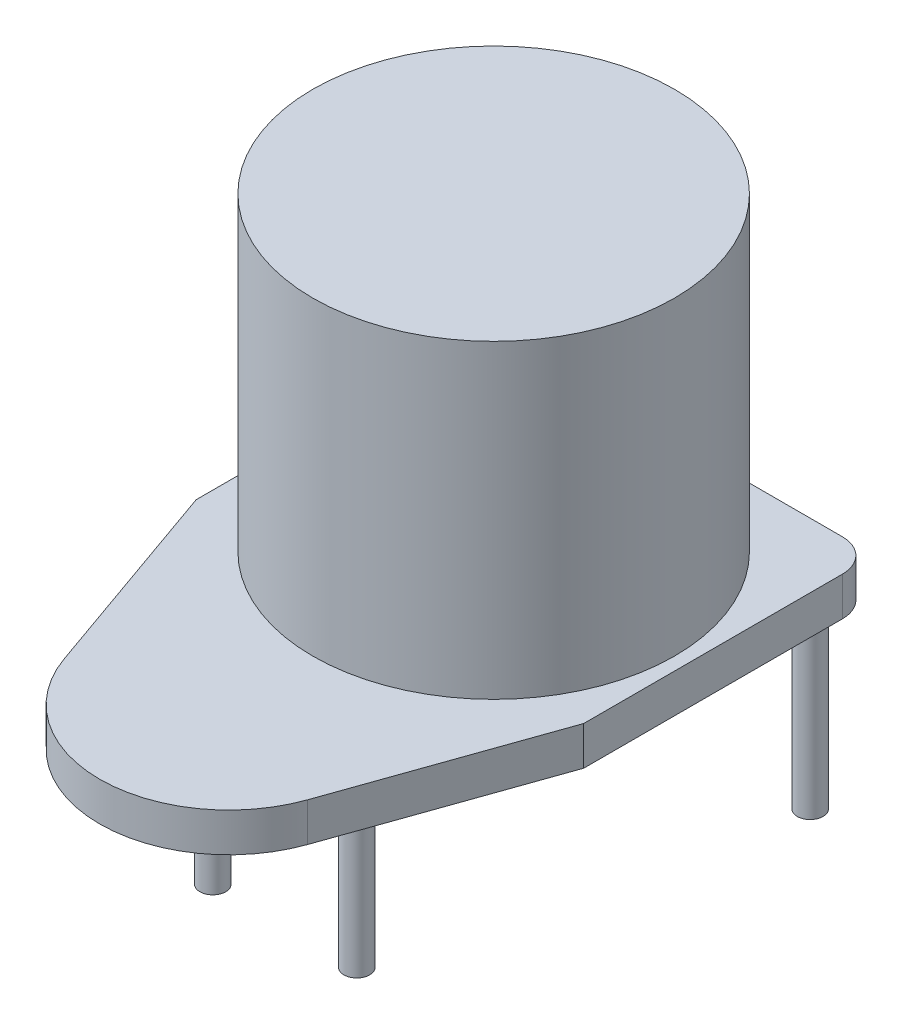
ISO-10303-21;
HEADER;
FILE_DESCRIPTION(('STEP AP214'),'2;1');
FILE_NAME('part.step','',(''),(''),'','','');
FILE_SCHEMA(('AUTOMOTIVE_DESIGN { 1 0 10303 214 1 1 1 1 }'));
ENDSEC;
DATA;
#1=APPLICATION_CONTEXT('core data for automotive mechanical design processes');
#2=APPLICATION_PROTOCOL_DEFINITION('international standard','automotive_design',2000,#1);
#3=PRODUCT_CONTEXT('',#1,'mechanical');
#4=PRODUCT('Part','Part','',(#3));
#5=PRODUCT_RELATED_PRODUCT_CATEGORY('part','',(#4));
#6=PRODUCT_DEFINITION_FORMATION('','',#4);
#7=PRODUCT_DEFINITION_CONTEXT('part definition',#1,'design');
#8=PRODUCT_DEFINITION('design','',#6,#7);
#9=PRODUCT_DEFINITION_SHAPE('','',#8);
#10=(LENGTH_UNIT() NAMED_UNIT(*) SI_UNIT(.MILLI.,.METRE.));
#11=(NAMED_UNIT(*) PLANE_ANGLE_UNIT() SI_UNIT($,.RADIAN.));
#12=(NAMED_UNIT(*) SI_UNIT($,.STERADIAN.) SOLID_ANGLE_UNIT());
#13=UNCERTAINTY_MEASURE_WITH_UNIT(LENGTH_MEASURE(1.E-05),#10,'distance_accuracy_value','');
#14=(GEOMETRIC_REPRESENTATION_CONTEXT(3) GLOBAL_UNCERTAINTY_ASSIGNED_CONTEXT((#13)) GLOBAL_UNIT_ASSIGNED_CONTEXT((#10,
#11,#12)) REPRESENTATION_CONTEXT('',''));
#15=CARTESIAN_POINT('',(0.,0.,0.));
#16=DIRECTION('',(0.,0.,1.));
#17=DIRECTION('',(1.,0.,0.));
#18=AXIS2_PLACEMENT_3D('',#15,#16,#17);
#19=CARTESIAN_POINT('',(-38.1,45.72,0.));
#20=DIRECTION('',(-1.,0.,0.));
#21=DIRECTION('',(0.,0.,1.));
#22=AXIS2_PLACEMENT_3D('',#19,#20,#21);
#23=PLANE('',#22);
#24=DIRECTION('',(0.,0.,-1.));
#25=VECTOR('',#24,1.);
#26=CARTESIAN_POINT('',(-38.1,45.72,0.));
#27=LINE('',#26,#25);
#28=CARTESIAN_POINT('',(-38.1,45.72,0.419392834796002));
#29=VERTEX_POINT('',#28);
#30=CARTESIAN_POINT('',(-38.1,45.72,-50.4498441610668));
#31=VERTEX_POINT('',#30);
#32=EDGE_CURVE('E161',#29,#31,#27,.T.);
#33=ORIENTED_EDGE('',*,*,#32,.T.);
#34=DIRECTION('',(0.,-1.,0.));
#35=VECTOR('',#34,1.);
#36=CARTESIAN_POINT('',(-38.1,38.1,-50.4498441610668));
#37=LINE('',#36,#35);
#38=CARTESIAN_POINT('',(-38.1,38.1,-50.4498441610668));
#39=VERTEX_POINT('',#38);
#40=EDGE_CURVE('E80',#31,#39,#37,.T.);
#41=ORIENTED_EDGE('',*,*,#40,.T.);
#42=DIRECTION('',(0.,0.,-1.));
#43=VECTOR('',#42,1.);
#44=CARTESIAN_POINT('',(-38.1,38.1,0.));
#45=LINE('',#44,#43);
#46=CARTESIAN_POINT('',(-38.1,38.1,0.419392834796002));
#47=VERTEX_POINT('',#46);
#48=EDGE_CURVE('E163',#47,#39,#45,.T.);
#49=ORIENTED_EDGE('',*,*,#48,.F.);
#50=DIRECTION('',(0.,-1.,0.));
#51=VECTOR('',#50,1.);
#52=CARTESIAN_POINT('',(-38.1,45.72,0.419392834796002));
#53=LINE('',#52,#51);
#54=EDGE_CURVE('E202',#29,#47,#53,.T.);
#55=ORIENTED_EDGE('',*,*,#54,.F.);
#56=EDGE_LOOP('',(#33,#41,#49,#55));
#57=FACE_BOUND('',#56,.T.);
#58=ADVANCED_FACE('F76',(#57),#23,.T.);
#59=CARTESIAN_POINT('',(0.,38.1,0.));
#60=DIRECTION('',(0.,1.,0.));
#61=DIRECTION('',(0.,0.,1.));
#62=AXIS2_PLACEMENT_3D('',#59,#60,#61);
#63=PLANE('',#62);
#64=CARTESIAN_POINT('',(14.1546468084681,38.1,21.0904237446174));
#65=DIRECTION('',(0.,1.,0.));
#66=DIRECTION('',(0.,0.,1.));
#67=AXIS2_PLACEMENT_3D('',#64,#65,#66);
#68=CIRCLE('',#67,2.54);
#69=CARTESIAN_POINT('',(14.1546468084681,38.1,23.6304237446175));
#70=VERTEX_POINT('',#69);
#71=EDGE_CURVE('E239',#70,#70,#68,.T.);
#72=ORIENTED_EDGE('',*,*,#71,.T.);
#73=EDGE_LOOP('',(#72));
#74=FACE_BOUND('',#73,.T.);
#75=CARTESIAN_POINT('',(-14.1546468084681,38.1,21.0904237446175));
#76=DIRECTION('',(0.,1.,0.));
#77=DIRECTION('',(0.,0.,1.));
#78=AXIS2_PLACEMENT_3D('',#75,#76,#77);
#79=CIRCLE('',#78,2.54);
#80=CARTESIAN_POINT('',(-14.1546468084681,38.1,23.6304237446175));
#81=VERTEX_POINT('',#80);
#82=EDGE_CURVE('E233',#81,#81,#79,.T.);
#83=ORIENTED_EDGE('',*,*,#82,.T.);
#84=EDGE_LOOP('',(#83));
#85=FACE_BOUND('',#84,.T.);
#86=CARTESIAN_POINT('',(31.75,38.1,-50.4498441610668));
#87=DIRECTION('',(0.,1.,0.));
#88=DIRECTION('',(0.,0.,1.));
#89=AXIS2_PLACEMENT_3D('',#86,#87,#88);
#90=CIRCLE('',#89,2.54);
#91=CARTESIAN_POINT('',(31.75,38.1,-47.9098441610668));
#92=VERTEX_POINT('',#91);
#93=EDGE_CURVE('E227',#92,#92,#90,.T.);
#94=ORIENTED_EDGE('',*,*,#93,.T.);
#95=EDGE_LOOP('',(#94));
#96=FACE_BOUND('',#95,.T.);
#97=CARTESIAN_POINT('',(-31.75,38.1,-50.4498441610668));
#98=DIRECTION('',(0.,1.,0.));
#99=DIRECTION('',(0.,0.,1.));
#100=AXIS2_PLACEMENT_3D('',#97,#98,#99);
#101=CIRCLE('',#100,2.54);
#102=CARTESIAN_POINT('',(-31.75,38.1,-47.9098441610668));
#103=VERTEX_POINT('',#102);
#104=EDGE_CURVE('E216',#103,#103,#101,.T.);
#105=ORIENTED_EDGE('',*,*,#104,.T.);
#106=EDGE_LOOP('',(#105));
#107=FACE_BOUND('',#106,.T.);
#108=DIRECTION('',(-1.,0.,0.));
#109=VECTOR('',#108,1.);
#110=CARTESIAN_POINT('',(0.,38.1,-56.7998441610668));
#111=LINE('',#110,#109);
#112=CARTESIAN_POINT('',(31.75,38.1,-56.7998441610668));
#113=VERTEX_POINT('',#112);
#114=CARTESIAN_POINT('',(-31.75,38.1,-56.7998441610668));
#115=VERTEX_POINT('',#114);
#116=EDGE_CURVE('E196',#113,#115,#111,.T.);
#117=ORIENTED_EDGE('',*,*,#116,.F.);
#118=CARTESIAN_POINT('',(31.75,38.1,-50.4498441610668));
#119=DIRECTION('',(0.,1.,0.));
#120=DIRECTION('',(0.,0.,1.));
#121=AXIS2_PLACEMENT_3D('',#118,#119,#120);
#122=CIRCLE('',#121,6.35);
#123=CARTESIAN_POINT('',(38.1,38.1,-50.4498441610668));
#124=VERTEX_POINT('',#123);
#125=EDGE_CURVE('E180',#113,#124,#122,.F.);
#126=ORIENTED_EDGE('',*,*,#125,.T.);
#127=DIRECTION('',(0.,0.,-1.));
#128=VECTOR('',#127,1.);
#129=CARTESIAN_POINT('',(38.1,38.1,0.));
#130=LINE('',#129,#128);
#131=CARTESIAN_POINT('',(38.1,38.1,0.419392834796007));
#132=VERTEX_POINT('',#131);
#133=EDGE_CURVE('E198',#132,#124,#130,.T.);
#134=ORIENTED_EDGE('',*,*,#133,.F.);
#135=DIRECTION('',(-0.33246409694842,0.,0.943115912409642));
#136=VECTOR('',#135,1.);
#137=CARTESIAN_POINT('',(34.0202180212385,38.1,11.9926945496247));
#138=LINE('',#137,#136);
#139=CARTESIAN_POINT('',(23.9551441752049,38.1,40.544743901423));
#140=VERTEX_POINT('',#139);
#141=EDGE_CURVE('E209',#132,#140,#138,.T.);
#142=ORIENTED_EDGE('',*,*,#141,.T.);
#143=CARTESIAN_POINT('',(0.,38.1,32.1001558389332));
#144=DIRECTION('',(0.,1.,0.));
#145=DIRECTION('',(0.,0.,1.));
#146=AXIS2_PLACEMENT_3D('',#143,#144,#145);
#147=CIRCLE('',#146,25.4);
#148=CARTESIAN_POINT('',(-23.9551441752049,38.1,40.544743901423));
#149=VERTEX_POINT('',#148);
#150=EDGE_CURVE('E211',#149,#140,#147,.T.);
#151=ORIENTED_EDGE('',*,*,#150,.F.);
#152=DIRECTION('',(0.33246409694842,0.,0.943115912409642));
#153=VECTOR('',#152,1.);
#154=CARTESIAN_POINT('',(-34.0202180212385,38.1,11.9926945496246));
#155=LINE('',#154,#153);
#156=EDGE_CURVE('E167',#47,#149,#155,.T.);
#157=ORIENTED_EDGE('',*,*,#156,.F.);
#158=ORIENTED_EDGE('',*,*,#48,.T.);
#159=CARTESIAN_POINT('',(-31.75,38.1,-50.4498441610668));
#160=DIRECTION('',(0.,1.,0.));
#161=DIRECTION('',(0.,0.,1.));
#162=AXIS2_PLACEMENT_3D('',#159,#160,#161);
#163=CIRCLE('',#162,6.35);
#164=EDGE_CURVE('E178',#39,#115,#163,.F.);
#165=ORIENTED_EDGE('',*,*,#164,.T.);
#166=EDGE_LOOP('',(#117,#126,#134,#142,#151,#157,#158,#165));
#167=FACE_BOUND('',#166,.T.);
#168=ADVANCED_FACE('F194',(#74,#85,#96,#107,#167),#63,.F.);
#169=CARTESIAN_POINT('',(0.,45.72,-56.7998441610668));
#170=DIRECTION('',(0.,0.,1.));
#171=DIRECTION('',(1.,0.,0.));
#172=AXIS2_PLACEMENT_3D('',#169,#170,#171);
#173=PLANE('',#172);
#174=DIRECTION('',(-1.,0.,0.));
#175=VECTOR('',#174,1.);
#176=CARTESIAN_POINT('',(0.,45.72,-56.7998441610668));
#177=LINE('',#176,#175);
#178=CARTESIAN_POINT('',(31.75,45.72,-56.7998441610668));
#179=VERTEX_POINT('',#178);
#180=CARTESIAN_POINT('',(-31.75,45.72,-56.7998441610668));
#181=VERTEX_POINT('',#180);
#182=EDGE_CURVE('E218',#179,#181,#177,.T.);
#183=ORIENTED_EDGE('',*,*,#182,.F.);
#184=DIRECTION('',(0.,-1.,0.));
#185=VECTOR('',#184,1.);
#186=CARTESIAN_POINT('',(31.75,45.72,-56.7998441610668));
#187=LINE('',#186,#185);
#188=EDGE_CURVE('E170',#179,#113,#187,.T.);
#189=ORIENTED_EDGE('',*,*,#188,.T.);
#190=ORIENTED_EDGE('',*,*,#116,.T.);
#191=DIRECTION('',(0.,-1.,0.));
#192=VECTOR('',#191,1.);
#193=CARTESIAN_POINT('',(-31.75,45.72,-56.7998441610668));
#194=LINE('',#193,#192);
#195=EDGE_CURVE('E168',#115,#181,#194,.F.);
#196=ORIENTED_EDGE('',*,*,#195,.T.);
#197=EDGE_LOOP('',(#183,#189,#190,#196));
#198=FACE_BOUND('',#197,.T.);
#199=ADVANCED_FACE('F270',(#198),#173,.F.);
#200=CARTESIAN_POINT('',(38.1,45.72,0.));
#201=DIRECTION('',(-1.,0.,0.));
#202=DIRECTION('',(0.,0.,1.));
#203=AXIS2_PLACEMENT_3D('',#200,#201,#202);
#204=PLANE('',#203);
#205=ORIENTED_EDGE('',*,*,#133,.T.);
#206=DIRECTION('',(0.,-1.,0.));
#207=VECTOR('',#206,1.);
#208=CARTESIAN_POINT('',(38.1,45.72,-50.4498441610668));
#209=LINE('',#208,#207);
#210=CARTESIAN_POINT('',(38.1,45.72,-50.4498441610668));
#211=VERTEX_POINT('',#210);
#212=EDGE_CURVE('E100',#124,#211,#209,.F.);
#213=ORIENTED_EDGE('',*,*,#212,.T.);
#214=DIRECTION('',(0.,0.,-1.));
#215=VECTOR('',#214,1.);
#216=CARTESIAN_POINT('',(38.1,45.72,0.));
#217=LINE('',#216,#215);
#218=CARTESIAN_POINT('',(38.1,45.72,0.419392834796007));
#219=VERTEX_POINT('',#218);
#220=EDGE_CURVE('E205',#219,#211,#217,.T.);
#221=ORIENTED_EDGE('',*,*,#220,.F.);
#222=DIRECTION('',(0.,-1.,0.));
#223=VECTOR('',#222,1.);
#224=CARTESIAN_POINT('',(38.1,45.72,0.419392834796007));
#225=LINE('',#224,#223);
#226=EDGE_CURVE('E172',#219,#132,#225,.T.);
#227=ORIENTED_EDGE('',*,*,#226,.T.);
#228=EDGE_LOOP('',(#205,#213,#221,#227));
#229=FACE_BOUND('',#228,.T.);
#230=ADVANCED_FACE('F204',(#229),#204,.F.);
#231=CARTESIAN_POINT('',(34.0202180212385,45.72,11.9926945496247));
#232=DIRECTION('',(0.943115912409642,0.,0.33246409694842));
#233=DIRECTION('',(0.33246409694842,0.,-0.943115912409642));
#234=AXIS2_PLACEMENT_3D('',#231,#232,#233);
#235=PLANE('',#234);
#236=ORIENTED_EDGE('',*,*,#141,.F.);
#237=ORIENTED_EDGE('',*,*,#226,.F.);
#238=DIRECTION('',(-0.33246409694842,0.,0.943115912409642));
#239=VECTOR('',#238,1.);
#240=CARTESIAN_POINT('',(34.0202180212385,45.72,11.9926945496247));
#241=LINE('',#240,#239);
#242=CARTESIAN_POINT('',(23.9551441752049,45.72,40.544743901423));
#243=VERTEX_POINT('',#242);
#244=EDGE_CURVE('E156',#219,#243,#241,.T.);
#245=ORIENTED_EDGE('',*,*,#244,.T.);
#246=DIRECTION('',(0.,-1.,0.));
#247=VECTOR('',#246,1.);
#248=CARTESIAN_POINT('',(23.9551441752049,45.72,40.544743901423));
#249=LINE('',#248,#247);
#250=EDGE_CURVE('E153',#243,#140,#249,.T.);
#251=ORIENTED_EDGE('',*,*,#250,.T.);
#252=EDGE_LOOP('',(#236,#237,#245,#251));
#253=FACE_BOUND('',#252,.T.);
#254=ADVANCED_FACE('F210',(#253),#235,.T.);
#255=CARTESIAN_POINT('',(0.,45.72,32.1001558389332));
#256=DIRECTION('',(0.,-1.,0.));
#257=DIRECTION('',(0.,0.,-1.));
#258=AXIS2_PLACEMENT_3D('',#255,#256,#257);
#259=CYLINDRICAL_SURFACE('',#258,25.4);
#260=ORIENTED_EDGE('',*,*,#150,.T.);
#261=ORIENTED_EDGE('',*,*,#250,.F.);
#262=CARTESIAN_POINT('',(0.,45.72,32.1001558389332));
#263=DIRECTION('',(0.,1.,0.));
#264=DIRECTION('',(0.,0.,1.));
#265=AXIS2_PLACEMENT_3D('',#262,#263,#264);
#266=CIRCLE('',#265,25.4);
#267=CARTESIAN_POINT('',(-23.9551441752049,45.72,40.544743901423));
#268=VERTEX_POINT('',#267);
#269=EDGE_CURVE('E146',#268,#243,#266,.T.);
#270=ORIENTED_EDGE('',*,*,#269,.F.);
#271=DIRECTION('',(0.,-1.,0.));
#272=VECTOR('',#271,1.);
#273=CARTESIAN_POINT('',(-23.9551441752049,45.72,40.544743901423));
#274=LINE('',#273,#272);
#275=EDGE_CURVE('E151',#268,#149,#274,.T.);
#276=ORIENTED_EDGE('',*,*,#275,.T.);
#277=EDGE_LOOP('',(#260,#261,#270,#276));
#278=FACE_BOUND('',#277,.T.);
#279=ADVANCED_FACE('F149',(#278),#259,.T.);
#280=CARTESIAN_POINT('',(-34.0202180212385,45.72,11.9926945496246));
#281=DIRECTION('',(0.943115912409642,0.,-0.33246409694842));
#282=DIRECTION('',(-0.33246409694842,0.,-0.943115912409642));
#283=AXIS2_PLACEMENT_3D('',#280,#281,#282);
#284=PLANE('',#283);
#285=ORIENTED_EDGE('',*,*,#156,.T.);
#286=ORIENTED_EDGE('',*,*,#275,.F.);
#287=DIRECTION('',(0.33246409694842,0.,0.943115912409642));
#288=VECTOR('',#287,1.);
#289=CARTESIAN_POINT('',(-34.0202180212385,45.72,11.9926945496246));
#290=LINE('',#289,#288);
#291=EDGE_CURVE('E157',#29,#268,#290,.T.);
#292=ORIENTED_EDGE('',*,*,#291,.F.);
#293=ORIENTED_EDGE('',*,*,#54,.T.);
#294=EDGE_LOOP('',(#285,#286,#292,#293));
#295=FACE_BOUND('',#294,.T.);
#296=ADVANCED_FACE('F165',(#295),#284,.F.);
#297=CARTESIAN_POINT('',(0.,45.72,0.));
#298=DIRECTION('',(0.,1.,0.));
#299=DIRECTION('',(0.,0.,1.));
#300=AXIS2_PLACEMENT_3D('',#297,#298,#299);
#301=PLANE('',#300);
#302=CARTESIAN_POINT('',(0.,45.72,-19.9698441610668));
#303=DIRECTION('',(0.,1.,0.));
#304=DIRECTION('',(0.,0.,1.));
#305=AXIS2_PLACEMENT_3D('',#302,#303,#304);
#306=CIRCLE('',#305,35.56);
#307=CARTESIAN_POINT('',(0.,45.72,-55.5298441610668));
#308=VERTEX_POINT('',#307);
#309=EDGE_CURVE('E12',#308,#308,#306,.T.);
#310=ORIENTED_EDGE('',*,*,#309,.F.);
#311=EDGE_LOOP('',(#310));
#312=FACE_BOUND('',#311,.T.);
#313=ORIENTED_EDGE('',*,*,#220,.T.);
#314=CARTESIAN_POINT('',(31.75,45.72,-50.4498441610668));
#315=DIRECTION('',(0.,1.,0.));
#316=DIRECTION('',(0.,0.,1.));
#317=AXIS2_PLACEMENT_3D('',#314,#315,#316);
#318=CIRCLE('',#317,6.35);
#319=EDGE_CURVE('E183',#211,#179,#318,.T.);
#320=ORIENTED_EDGE('',*,*,#319,.T.);
#321=ORIENTED_EDGE('',*,*,#182,.T.);
#322=CARTESIAN_POINT('',(-31.75,45.72,-50.4498441610668));
#323=DIRECTION('',(0.,1.,0.));
#324=DIRECTION('',(0.,0.,1.));
#325=AXIS2_PLACEMENT_3D('',#322,#323,#324);
#326=CIRCLE('',#325,6.35);
#327=EDGE_CURVE('E92',#181,#31,#326,.T.);
#328=ORIENTED_EDGE('',*,*,#327,.T.);
#329=ORIENTED_EDGE('',*,*,#32,.F.);
#330=ORIENTED_EDGE('',*,*,#291,.T.);
#331=ORIENTED_EDGE('',*,*,#269,.T.);
#332=ORIENTED_EDGE('',*,*,#244,.F.);
#333=EDGE_LOOP('',(#313,#320,#321,#328,#329,#330,#331,#332));
#334=FACE_BOUND('',#333,.T.);
#335=ADVANCED_FACE('F160',(#312,#334),#301,.T.);
#336=CARTESIAN_POINT('',(31.75,45.72,-50.4498441610668));
#337=DIRECTION('',(0.,-1.,0.));
#338=DIRECTION('',(0.,0.,-1.));
#339=AXIS2_PLACEMENT_3D('',#336,#337,#338);
#340=CYLINDRICAL_SURFACE('',#339,6.35);
#341=ORIENTED_EDGE('',*,*,#319,.F.);
#342=ORIENTED_EDGE('',*,*,#212,.F.);
#343=ORIENTED_EDGE('',*,*,#125,.F.);
#344=ORIENTED_EDGE('',*,*,#188,.F.);
#345=EDGE_LOOP('',(#341,#342,#343,#344));
#346=FACE_BOUND('',#345,.T.);
#347=ADVANCED_FACE('F259',(#346),#340,.T.);
#348=CARTESIAN_POINT('',(-31.75,45.72,-50.4498441610668));
#349=DIRECTION('',(0.,1.,0.));
#350=DIRECTION('',(0.,0.,1.));
#351=AXIS2_PLACEMENT_3D('',#348,#349,#350);
#352=CYLINDRICAL_SURFACE('',#351,6.35);
#353=ORIENTED_EDGE('',*,*,#327,.F.);
#354=ORIENTED_EDGE('',*,*,#195,.F.);
#355=ORIENTED_EDGE('',*,*,#164,.F.);
#356=ORIENTED_EDGE('',*,*,#40,.F.);
#357=EDGE_LOOP('',(#353,#354,#355,#356));
#358=FACE_BOUND('',#357,.T.);
#359=ADVANCED_FACE('F78',(#358),#352,.T.);
#360=CARTESIAN_POINT('',(-31.75,2.54000000000001,-50.4498441610668));
#361=DIRECTION('',(0.,1.,0.));
#362=DIRECTION('',(0.,0.,1.));
#363=AXIS2_PLACEMENT_3D('',#360,#361,#362);
#364=CYLINDRICAL_SURFACE('',#363,2.54);
#365=CARTESIAN_POINT('',(-31.75,2.54000000000001,-50.4498441610668));
#366=DIRECTION('',(0.,1.,0.));
#367=DIRECTION('',(0.,0.,1.));
#368=AXIS2_PLACEMENT_3D('',#365,#366,#367);
#369=CIRCLE('',#368,2.54);
#370=CARTESIAN_POINT('',(-31.75,2.54000000000001,-47.9098441610668));
#371=VERTEX_POINT('',#370);
#372=EDGE_CURVE('E224',#371,#371,#369,.T.);
#373=ORIENTED_EDGE('',*,*,#372,.T.);
#374=EDGE_LOOP('',(#373));
#375=FACE_BOUND('',#374,.T.);
#376=ORIENTED_EDGE('',*,*,#104,.F.);
#377=EDGE_LOOP('',(#376));
#378=FACE_BOUND('',#377,.T.);
#379=ADVANCED_FACE('F334',(#375,#378),#364,.T.);
#380=CARTESIAN_POINT('',(0.,2.54000000000001,0.));
#381=DIRECTION('',(0.,1.,0.));
#382=DIRECTION('',(0.,0.,1.));
#383=AXIS2_PLACEMENT_3D('',#380,#381,#382);
#384=PLANE('',#383);
#385=ORIENTED_EDGE('',*,*,#372,.F.);
#386=EDGE_LOOP('',(#385));
#387=FACE_BOUND('',#386,.T.);
#388=ADVANCED_FACE('F347',(#387),#384,.F.);
#389=CARTESIAN_POINT('',(31.75,2.54000000000001,-50.4498441610668));
#390=DIRECTION('',(0.,1.,0.));
#391=DIRECTION('',(0.,0.,1.));
#392=AXIS2_PLACEMENT_3D('',#389,#390,#391);
#393=CYLINDRICAL_SURFACE('',#392,2.54);
#394=CARTESIAN_POINT('',(31.75,2.54000000000001,-50.4498441610668));
#395=DIRECTION('',(0.,1.,0.));
#396=DIRECTION('',(0.,0.,1.));
#397=AXIS2_PLACEMENT_3D('',#394,#395,#396);
#398=CIRCLE('',#397,2.54);
#399=CARTESIAN_POINT('',(31.75,2.54000000000001,-47.9098441610668));
#400=VERTEX_POINT('',#399);
#401=EDGE_CURVE('E230',#400,#400,#398,.T.);
#402=ORIENTED_EDGE('',*,*,#401,.T.);
#403=EDGE_LOOP('',(#402));
#404=FACE_BOUND('',#403,.T.);
#405=ORIENTED_EDGE('',*,*,#93,.F.);
#406=EDGE_LOOP('',(#405));
#407=FACE_BOUND('',#406,.T.);
#408=ADVANCED_FACE('F356',(#404,#407),#393,.T.);
#409=CARTESIAN_POINT('',(0.,2.54000000000001,0.));
#410=DIRECTION('',(0.,1.,0.));
#411=DIRECTION('',(0.,0.,1.));
#412=AXIS2_PLACEMENT_3D('',#409,#410,#411);
#413=PLANE('',#412);
#414=ORIENTED_EDGE('',*,*,#401,.F.);
#415=EDGE_LOOP('',(#414));
#416=FACE_BOUND('',#415,.T.);
#417=ADVANCED_FACE('F366',(#416),#413,.F.);
#418=CARTESIAN_POINT('',(-14.1546468084681,2.54000000000001,21.0904237446175));
#419=DIRECTION('',(0.,1.,0.));
#420=DIRECTION('',(0.,0.,1.));
#421=AXIS2_PLACEMENT_3D('',#418,#419,#420);
#422=CYLINDRICAL_SURFACE('',#421,2.54);
#423=CARTESIAN_POINT('',(-14.1546468084681,2.54000000000001,21.0904237446175));
#424=DIRECTION('',(0.,1.,0.));
#425=DIRECTION('',(0.,0.,1.));
#426=AXIS2_PLACEMENT_3D('',#423,#424,#425);
#427=CIRCLE('',#426,2.54);
#428=CARTESIAN_POINT('',(-14.1546468084681,2.54000000000001,23.6304237446175));
#429=VERTEX_POINT('',#428);
#430=EDGE_CURVE('E236',#429,#429,#427,.T.);
#431=ORIENTED_EDGE('',*,*,#430,.T.);
#432=EDGE_LOOP('',(#431));
#433=FACE_BOUND('',#432,.T.);
#434=ORIENTED_EDGE('',*,*,#82,.F.);
#435=EDGE_LOOP('',(#434));
#436=FACE_BOUND('',#435,.T.);
#437=ADVANCED_FACE('F376',(#433,#436),#422,.T.);
#438=CARTESIAN_POINT('',(0.,2.54000000000001,0.));
#439=DIRECTION('',(0.,1.,0.));
#440=DIRECTION('',(0.,0.,1.));
#441=AXIS2_PLACEMENT_3D('',#438,#439,#440);
#442=PLANE('',#441);
#443=ORIENTED_EDGE('',*,*,#430,.F.);
#444=EDGE_LOOP('',(#443));
#445=FACE_BOUND('',#444,.T.);
#446=ADVANCED_FACE('F386',(#445),#442,.F.);
#447=CARTESIAN_POINT('',(14.1546468084681,2.54000000000001,21.0904237446174));
#448=DIRECTION('',(0.,1.,0.));
#449=DIRECTION('',(0.,0.,1.));
#450=AXIS2_PLACEMENT_3D('',#447,#448,#449);
#451=CYLINDRICAL_SURFACE('',#450,2.54);
#452=CARTESIAN_POINT('',(14.1546468084681,2.54000000000001,21.0904237446174));
#453=DIRECTION('',(0.,1.,0.));
#454=DIRECTION('',(0.,0.,1.));
#455=AXIS2_PLACEMENT_3D('',#452,#453,#454);
#456=CIRCLE('',#455,2.54);
#457=CARTESIAN_POINT('',(14.1546468084681,2.54000000000001,23.6304237446175));
#458=VERTEX_POINT('',#457);
#459=EDGE_CURVE('E242',#458,#458,#456,.T.);
#460=ORIENTED_EDGE('',*,*,#459,.T.);
#461=EDGE_LOOP('',(#460));
#462=FACE_BOUND('',#461,.T.);
#463=ORIENTED_EDGE('',*,*,#71,.F.);
#464=EDGE_LOOP('',(#463));
#465=FACE_BOUND('',#464,.T.);
#466=ADVANCED_FACE('F396',(#462,#465),#451,.T.);
#467=CARTESIAN_POINT('',(0.,2.54000000000001,0.));
#468=DIRECTION('',(0.,1.,0.));
#469=DIRECTION('',(0.,0.,1.));
#470=AXIS2_PLACEMENT_3D('',#467,#468,#469);
#471=PLANE('',#470);
#472=ORIENTED_EDGE('',*,*,#459,.F.);
#473=EDGE_LOOP('',(#472));
#474=FACE_BOUND('',#473,.T.);
#475=ADVANCED_FACE('F254',(#474),#471,.F.);
#476=CARTESIAN_POINT('',(0.,106.68,-19.9698441610668));
#477=DIRECTION('',(0.,-1.,0.));
#478=DIRECTION('',(0.,0.,-1.));
#479=AXIS2_PLACEMENT_3D('',#476,#477,#478);
#480=CYLINDRICAL_SURFACE('',#479,35.56);
#481=CARTESIAN_POINT('',(0.,106.68,-19.9698441610668));
#482=DIRECTION('',(0.,1.,0.));
#483=DIRECTION('',(0.,0.,1.));
#484=AXIS2_PLACEMENT_3D('',#481,#482,#483);
#485=CIRCLE('',#484,35.56);
#486=CARTESIAN_POINT('',(0.,106.68,-55.5298441610668));
#487=VERTEX_POINT('',#486);
#488=EDGE_CURVE('E244',#487,#487,#485,.T.);
#489=CARTESIAN_POINT('',(0.,106.68,-55.5298441610668));
#490=CARTESIAN_POINT('',(0.,106.045,-55.5298441610668));
#491=CARTESIAN_POINT('',(0.,105.41,-55.5298441610668));
#492=CARTESIAN_POINT('',(0.,104.14,-55.5298441610668));
#493=CARTESIAN_POINT('',(0.,103.505,-55.5298441610668));
#494=CARTESIAN_POINT('',(0.,102.235,-55.5298441610668));
#495=CARTESIAN_POINT('',(0.,101.6,-55.5298441610668));
#496=CARTESIAN_POINT('',(0.,100.33,-55.5298441610668));
#497=CARTESIAN_POINT('',(0.,99.695,-55.5298441610668));
#498=CARTESIAN_POINT('',(0.,98.425,-55.5298441610668));
#499=CARTESIAN_POINT('',(0.,97.79,-55.5298441610668));
#500=CARTESIAN_POINT('',(0.,96.52,-55.5298441610668));
#501=CARTESIAN_POINT('',(0.,95.885,-55.5298441610668));
#502=CARTESIAN_POINT('',(0.,94.615,-55.5298441610668));
#503=CARTESIAN_POINT('',(0.,93.98,-55.5298441610668));
#504=CARTESIAN_POINT('',(0.,92.71,-55.5298441610668));
#505=CARTESIAN_POINT('',(0.,92.075,-55.5298441610668));
#506=CARTESIAN_POINT('',(0.,90.805,-55.5298441610668));
#507=CARTESIAN_POINT('',(0.,90.17,-55.5298441610668));
#508=CARTESIAN_POINT('',(0.,88.9,-55.5298441610668));
#509=CARTESIAN_POINT('',(0.,88.265,-55.5298441610668));
#510=CARTESIAN_POINT('',(0.,86.995,-55.5298441610668));
#511=CARTESIAN_POINT('',(0.,86.36,-55.5298441610668));
#512=CARTESIAN_POINT('',(0.,85.09,-55.5298441610668));
#513=CARTESIAN_POINT('',(0.,84.455,-55.5298441610668));
#514=CARTESIAN_POINT('',(0.,83.185,-55.5298441610668));
#515=CARTESIAN_POINT('',(0.,82.55,-55.5298441610668));
#516=CARTESIAN_POINT('',(0.,81.28,-55.5298441610668));
#517=CARTESIAN_POINT('',(0.,80.645,-55.5298441610668));
#518=CARTESIAN_POINT('',(0.,79.375,-55.5298441610668));
#519=CARTESIAN_POINT('',(0.,78.74,-55.5298441610668));
#520=CARTESIAN_POINT('',(0.,77.47,-55.5298441610668));
#521=CARTESIAN_POINT('',(0.,76.835,-55.5298441610668));
#522=CARTESIAN_POINT('',(0.,75.565,-55.5298441610668));
#523=CARTESIAN_POINT('',(0.,74.93,-55.5298441610668));
#524=CARTESIAN_POINT('',(0.,73.66,-55.5298441610668));
#525=CARTESIAN_POINT('',(0.,73.025,-55.5298441610668));
#526=CARTESIAN_POINT('',(0.,71.755,-55.5298441610668));
#527=CARTESIAN_POINT('',(0.,71.12,-55.5298441610668));
#528=CARTESIAN_POINT('',(0.,69.85,-55.5298441610668));
#529=CARTESIAN_POINT('',(0.,69.215,-55.5298441610668));
#530=CARTESIAN_POINT('',(0.,67.945,-55.5298441610668));
#531=CARTESIAN_POINT('',(0.,67.31,-55.5298441610668));
#532=CARTESIAN_POINT('',(0.,66.04,-55.5298441610668));
#533=CARTESIAN_POINT('',(0.,65.405,-55.5298441610668));
#534=CARTESIAN_POINT('',(0.,64.135,-55.5298441610668));
#535=CARTESIAN_POINT('',(0.,63.5,-55.5298441610668));
#536=CARTESIAN_POINT('',(0.,62.23,-55.5298441610668));
#537=CARTESIAN_POINT('',(0.,61.595,-55.5298441610668));
#538=CARTESIAN_POINT('',(0.,60.325,-55.5298441610668));
#539=CARTESIAN_POINT('',(0.,59.69,-55.5298441610668));
#540=CARTESIAN_POINT('',(0.,58.42,-55.5298441610668));
#541=CARTESIAN_POINT('',(0.,57.785,-55.5298441610668));
#542=CARTESIAN_POINT('',(0.,56.515,-55.5298441610668));
#543=CARTESIAN_POINT('',(0.,55.88,-55.5298441610668));
#544=CARTESIAN_POINT('',(0.,54.61,-55.5298441610668));
#545=CARTESIAN_POINT('',(0.,53.975,-55.5298441610668));
#546=CARTESIAN_POINT('',(0.,52.705,-55.5298441610668));
#547=CARTESIAN_POINT('',(0.,52.07,-55.5298441610668));
#548=CARTESIAN_POINT('',(0.,50.8,-55.5298441610668));
#549=CARTESIAN_POINT('',(0.,50.165,-55.5298441610668));
#550=CARTESIAN_POINT('',(0.,48.895,-55.5298441610668));
#551=CARTESIAN_POINT('',(0.,48.26,-55.5298441610668));
#552=CARTESIAN_POINT('',(0.,46.99,-55.5298441610668));
#553=CARTESIAN_POINT('',(0.,46.355,-55.5298441610668));
#554=CARTESIAN_POINT('',(0.,45.72,-55.5298441610668));
#555=B_SPLINE_CURVE_WITH_KNOTS('',3,(#489,#490,#491,#492,#493,#494,#495,#496,#497,#498,#499,
#500,#501,#502,#503,#504,#505,#506,#507,#508,#509,#510,#511,#512,#513,#514,#515,#516,#517,#518,
#519,#520,#521,#522,#523,#524,#525,#526,#527,#528,#529,#530,#531,#532,#533,#534,#535,#536,#537,
#538,#539,#540,#541,#542,#543,#544,#545,#546,#547,#548,#549,#550,#551,#552,#553,#554),
.UNSPECIFIED.,.F.,.F.,(4,2,2,2,2,2,2,2,2,2,2,2,2,2,2,2,2,2,2,2,2,2,2,2,2,2,2,2,2,2,2,2,4),(0.,
1.905,3.81000000000001,5.71500000000001,7.62,9.52500000000001,11.43,13.335,15.24,17.145,19.05,
20.955,22.86,24.765,26.67,28.575,30.48,32.385,34.29,36.195,38.1,40.005,41.91,43.815,45.72,
47.625,49.53,51.435,53.34,55.245,57.15,59.055,60.96),.UNSPECIFIED.);
#556=EDGE_CURVE('BSEAM251',#487,#308,#555,.T.);
#557=ORIENTED_EDGE('',*,*,#488,.F.);
#558=ORIENTED_EDGE('',*,*,#309,.T.);
#559=ORIENTED_EDGE('',*,*,#556,.T.);
#560=ORIENTED_EDGE('',*,*,#556,.F.);
#561=EDGE_LOOP('',(#557,#559,#558,#560));
#562=FACE_BOUND('',#561,.T.);
#563=ADVANCED_FACE('F251',(#562),#480,.T.);
#564=CARTESIAN_POINT('',(0.,106.68,-19.9698441610668));
#565=DIRECTION('',(0.,1.,0.));
#566=DIRECTION('',(0.,0.,1.));
#567=AXIS2_PLACEMENT_3D('',#564,#565,#566);
#568=PLANE('',#567);
#569=ORIENTED_EDGE('',*,*,#488,.T.);
#570=EDGE_LOOP('',(#569));
#571=FACE_BOUND('',#570,.T.);
#572=ADVANCED_FACE('F249',(#571),#568,.T.);
#573=CLOSED_SHELL('',(#58,#168,#199,#230,#254,#279,#296,#335,#347,#359,#379,#388,#408,#417,#437,
#446,#466,#475,#563,#572));
#574=MANIFOLD_SOLID_BREP('B2',#573);
#575=ADVANCED_BREP_SHAPE_REPRESENTATION('',(#18,#574),#14);
#576=SHAPE_DEFINITION_REPRESENTATION(#9,#575);
ENDSEC;
END-ISO-10303-21;
